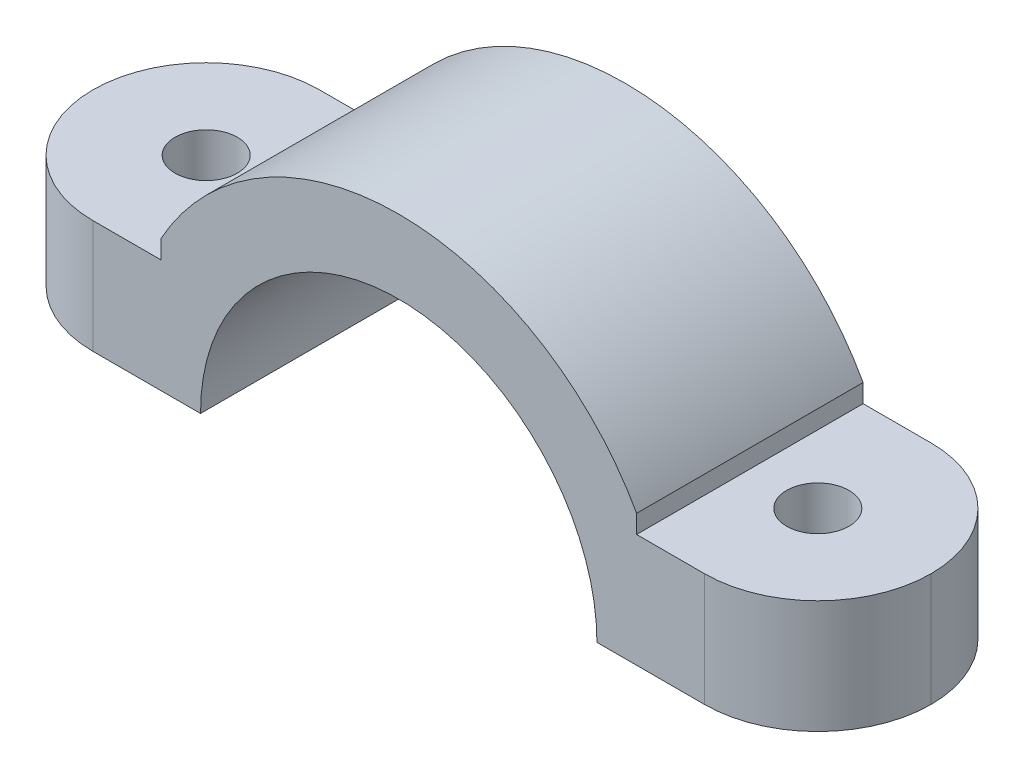
ISO-10303-21;
HEADER;
FILE_DESCRIPTION(('STEP AP214'),'2;1');
FILE_NAME('part.step','',(''),(''),'','','');
FILE_SCHEMA(('AUTOMOTIVE_DESIGN { 1 0 10303 214 1 1 1 1 }'));
ENDSEC;
DATA;
#1=APPLICATION_CONTEXT('core data for automotive mechanical design processes');
#2=APPLICATION_PROTOCOL_DEFINITION('international standard','automotive_design',2000,#1);
#3=PRODUCT_CONTEXT('',#1,'mechanical');
#4=PRODUCT('Part','Part','',(#3));
#5=PRODUCT_RELATED_PRODUCT_CATEGORY('part','',(#4));
#6=PRODUCT_DEFINITION_FORMATION('','',#4);
#7=PRODUCT_DEFINITION_CONTEXT('part definition',#1,'design');
#8=PRODUCT_DEFINITION('design','',#6,#7);
#9=PRODUCT_DEFINITION_SHAPE('','',#8);
#10=(LENGTH_UNIT() NAMED_UNIT(*) SI_UNIT(.MILLI.,.METRE.));
#11=(NAMED_UNIT(*) PLANE_ANGLE_UNIT() SI_UNIT($,.RADIAN.));
#12=(NAMED_UNIT(*) SI_UNIT($,.STERADIAN.) SOLID_ANGLE_UNIT());
#13=UNCERTAINTY_MEASURE_WITH_UNIT(LENGTH_MEASURE(1.E-05),#10,'distance_accuracy_value','');
#14=(GEOMETRIC_REPRESENTATION_CONTEXT(3) GLOBAL_UNCERTAINTY_ASSIGNED_CONTEXT((#13)) GLOBAL_UNIT_ASSIGNED_CONTEXT((#10,
#11,#12)) REPRESENTATION_CONTEXT('',''));
#15=CARTESIAN_POINT('',(0.,0.,0.));
#16=DIRECTION('',(0.,0.,1.));
#17=DIRECTION('',(1.,0.,0.));
#18=AXIS2_PLACEMENT_3D('',#15,#16,#17);
#19=CARTESIAN_POINT('',(-74.,20.,-20.));
#20=DIRECTION('',(0.,1.,0.));
#21=DIRECTION('',(0.,0.,1.));
#22=AXIS2_PLACEMENT_3D('',#19,#20,#21);
#23=PLANE('',#22);
#24=CARTESIAN_POINT('',(-54.,20.,0.));
#25=DIRECTION('',(0.,1.,0.));
#26=DIRECTION('',(0.,0.,1.));
#27=AXIS2_PLACEMENT_3D('',#24,#25,#26);
#28=CIRCLE('',#27,5.5);
#29=CARTESIAN_POINT('',(-54.,20.,5.5));
#30=VERTEX_POINT('',#29);
#31=EDGE_CURVE('E217',#30,#30,#28,.T.);
#32=ORIENTED_EDGE('',*,*,#31,.F.);
#33=EDGE_LOOP('',(#32));
#34=FACE_BOUND('',#33,.T.);
#35=DIRECTION('',(-1.,0.,0.));
#36=VECTOR('',#35,1.);
#37=CARTESIAN_POINT('',(-74.,20.,-20.));
#38=LINE('',#37,#36);
#39=CARTESIAN_POINT('',(-42.,20.,-20.));
#40=VERTEX_POINT('',#39);
#41=CARTESIAN_POINT('',(-54.,20.,-20.));
#42=VERTEX_POINT('',#41);
#43=EDGE_CURVE('E146',#40,#42,#38,.T.);
#44=ORIENTED_EDGE('',*,*,#43,.T.);
#45=CARTESIAN_POINT('',(-54.,20.,0.));
#46=DIRECTION('',(0.,1.,0.));
#47=DIRECTION('',(0.,0.,1.));
#48=AXIS2_PLACEMENT_3D('',#45,#46,#47);
#49=CIRCLE('',#48,20.);
#50=CARTESIAN_POINT('',(-74.,20.,0.));
#51=VERTEX_POINT('',#50);
#52=EDGE_CURVE('E207',#42,#51,#49,.T.);
#53=ORIENTED_EDGE('',*,*,#52,.T.);
#54=CARTESIAN_POINT('',(-54.,20.,0.));
#55=DIRECTION('',(0.,1.,0.));
#56=DIRECTION('',(0.,0.,1.));
#57=AXIS2_PLACEMENT_3D('',#54,#55,#56);
#58=CIRCLE('',#57,20.);
#59=CARTESIAN_POINT('',(-54.,20.,20.));
#60=VERTEX_POINT('',#59);
#61=EDGE_CURVE('E205',#51,#60,#58,.T.);
#62=ORIENTED_EDGE('',*,*,#61,.T.);
#63=DIRECTION('',(-1.,0.,0.));
#64=VECTOR('',#63,1.);
#65=CARTESIAN_POINT('',(-74.,20.,20.));
#66=LINE('',#65,#64);
#67=CARTESIAN_POINT('',(-42.,20.,20.));
#68=VERTEX_POINT('',#67);
#69=EDGE_CURVE('E165',#68,#60,#66,.T.);
#70=ORIENTED_EDGE('',*,*,#69,.F.);
#71=DIRECTION('',(0.,0.,1.));
#72=VECTOR('',#71,1.);
#73=CARTESIAN_POINT('',(-42.,20.,-20.));
#74=LINE('',#73,#72);
#75=EDGE_CURVE('E185',#40,#68,#74,.T.);
#76=ORIENTED_EDGE('',*,*,#75,.F.);
#77=EDGE_LOOP('',(#44,#53,#62,#70,#76));
#78=FACE_BOUND('',#77,.T.);
#79=ADVANCED_FACE('F33',(#34,#78),#23,.T.);
#80=CARTESIAN_POINT('',(-42.,23.2379000772445,-20.));
#81=DIRECTION('',(-1.,0.,0.));
#82=DIRECTION('',(0.,0.,1.));
#83=AXIS2_PLACEMENT_3D('',#80,#81,#82);
#84=PLANE('',#83);
#85=ORIENTED_EDGE('',*,*,#75,.T.);
#86=DIRECTION('',(0.,-1.,0.));
#87=VECTOR('',#86,1.);
#88=CARTESIAN_POINT('',(-42.,23.2379000772445,20.));
#89=LINE('',#88,#87);
#90=CARTESIAN_POINT('',(-42.,23.2379000772445,20.));
#91=VERTEX_POINT('',#90);
#92=EDGE_CURVE('E162',#91,#68,#89,.T.);
#93=ORIENTED_EDGE('',*,*,#92,.F.);
#94=DIRECTION('',(0.,0.,1.));
#95=VECTOR('',#94,1.);
#96=CARTESIAN_POINT('',(-42.,23.2379000772445,-20.));
#97=LINE('',#96,#95);
#98=CARTESIAN_POINT('',(-42.,23.2379000772445,-20.));
#99=VERTEX_POINT('',#98);
#100=EDGE_CURVE('E188',#99,#91,#97,.T.);
#101=ORIENTED_EDGE('',*,*,#100,.F.);
#102=DIRECTION('',(0.,-1.,0.));
#103=VECTOR('',#102,1.);
#104=CARTESIAN_POINT('',(-42.,23.2379000772445,-20.));
#105=LINE('',#104,#103);
#106=EDGE_CURVE('E180',#99,#40,#105,.T.);
#107=ORIENTED_EDGE('',*,*,#106,.T.);
#108=EDGE_LOOP('',(#85,#93,#101,#107));
#109=FACE_BOUND('',#108,.T.);
#110=ADVANCED_FACE('F245',(#109),#84,.T.);
#111=CARTESIAN_POINT('',(0.,0.,-20.));
#112=DIRECTION('',(0.,0.,1.));
#113=DIRECTION('',(1.,0.,0.));
#114=AXIS2_PLACEMENT_3D('',#111,#112,#113);
#115=CYLINDRICAL_SURFACE('',#114,48.);
#116=ORIENTED_EDGE('',*,*,#100,.T.);
#117=CARTESIAN_POINT('',(0.,0.,20.));
#118=DIRECTION('',(0.,0.,1.));
#119=DIRECTION('',(1.,0.,0.));
#120=AXIS2_PLACEMENT_3D('',#117,#118,#119);
#121=CIRCLE('',#120,48.);
#122=CARTESIAN_POINT('',(42.,23.2379000772445,20.));
#123=VERTEX_POINT('',#122);
#124=EDGE_CURVE('E159',#123,#91,#121,.T.);
#125=ORIENTED_EDGE('',*,*,#124,.F.);
#126=DIRECTION('',(0.,0.,1.));
#127=VECTOR('',#126,1.);
#128=CARTESIAN_POINT('',(42.,23.2379000772445,-20.));
#129=LINE('',#128,#127);
#130=CARTESIAN_POINT('',(42.,23.2379000772445,-20.));
#131=VERTEX_POINT('',#130);
#132=EDGE_CURVE('E190',#131,#123,#129,.T.);
#133=ORIENTED_EDGE('',*,*,#132,.F.);
#134=CARTESIAN_POINT('',(0.,0.,-20.));
#135=DIRECTION('',(0.,0.,1.));
#136=DIRECTION('',(1.,0.,0.));
#137=AXIS2_PLACEMENT_3D('',#134,#135,#136);
#138=CIRCLE('',#137,48.);
#139=EDGE_CURVE('E177',#131,#99,#138,.T.);
#140=ORIENTED_EDGE('',*,*,#139,.T.);
#141=EDGE_LOOP('',(#116,#125,#133,#140));
#142=FACE_BOUND('',#141,.T.);
#143=ADVANCED_FACE('F241',(#142),#115,.T.);
#144=CARTESIAN_POINT('',(42.,23.2379000772445,-20.));
#145=DIRECTION('',(1.,0.,0.));
#146=DIRECTION('',(0.,0.,-1.));
#147=AXIS2_PLACEMENT_3D('',#144,#145,#146);
#148=PLANE('',#147);
#149=ORIENTED_EDGE('',*,*,#132,.T.);
#150=DIRECTION('',(0.,1.,0.));
#151=VECTOR('',#150,1.);
#152=CARTESIAN_POINT('',(42.,23.2379000772445,20.));
#153=LINE('',#152,#151);
#154=CARTESIAN_POINT('',(42.,20.,20.));
#155=VERTEX_POINT('',#154);
#156=EDGE_CURVE('E156',#155,#123,#153,.T.);
#157=ORIENTED_EDGE('',*,*,#156,.F.);
#158=DIRECTION('',(0.,0.,1.));
#159=VECTOR('',#158,1.);
#160=CARTESIAN_POINT('',(42.,20.,-20.));
#161=LINE('',#160,#159);
#162=CARTESIAN_POINT('',(42.,20.,-20.));
#163=VERTEX_POINT('',#162);
#164=EDGE_CURVE('E192',#163,#155,#161,.T.);
#165=ORIENTED_EDGE('',*,*,#164,.F.);
#166=DIRECTION('',(0.,1.,0.));
#167=VECTOR('',#166,1.);
#168=CARTESIAN_POINT('',(42.,23.2379000772445,-20.));
#169=LINE('',#168,#167);
#170=EDGE_CURVE('E174',#163,#131,#169,.T.);
#171=ORIENTED_EDGE('',*,*,#170,.T.);
#172=EDGE_LOOP('',(#149,#157,#165,#171));
#173=FACE_BOUND('',#172,.T.);
#174=ADVANCED_FACE('F237',(#173),#148,.T.);
#175=CARTESIAN_POINT('',(42.,20.,-20.));
#176=DIRECTION('',(0.,1.,0.));
#177=DIRECTION('',(0.,0.,1.));
#178=AXIS2_PLACEMENT_3D('',#175,#176,#177);
#179=PLANE('',#178);
#180=CARTESIAN_POINT('',(54.,20.,0.));
#181=DIRECTION('',(0.,1.,0.));
#182=DIRECTION('',(0.,0.,1.));
#183=AXIS2_PLACEMENT_3D('',#180,#181,#182);
#184=CIRCLE('',#183,5.5);
#185=CARTESIAN_POINT('',(54.,20.,5.5));
#186=VERTEX_POINT('',#185);
#187=EDGE_CURVE('E296',#186,#186,#184,.T.);
#188=ORIENTED_EDGE('',*,*,#187,.F.);
#189=EDGE_LOOP('',(#188));
#190=FACE_BOUND('',#189,.T.);
#191=CARTESIAN_POINT('',(54.,20.,0.));
#192=DIRECTION('',(0.,1.,0.));
#193=DIRECTION('',(0.,0.,1.));
#194=AXIS2_PLACEMENT_3D('',#191,#192,#193);
#195=CIRCLE('',#194,20.);
#196=CARTESIAN_POINT('',(54.,20.,20.));
#197=VERTEX_POINT('',#196);
#198=CARTESIAN_POINT('',(74.,20.,0.));
#199=VERTEX_POINT('',#198);
#200=EDGE_CURVE('E56',#197,#199,#195,.T.);
#201=ORIENTED_EDGE('',*,*,#200,.T.);
#202=CARTESIAN_POINT('',(54.,20.,0.));
#203=DIRECTION('',(0.,1.,0.));
#204=DIRECTION('',(0.,0.,1.));
#205=AXIS2_PLACEMENT_3D('',#202,#203,#204);
#206=CIRCLE('',#205,20.);
#207=CARTESIAN_POINT('',(54.,20.,-20.));
#208=VERTEX_POINT('',#207);
#209=EDGE_CURVE('E213',#199,#208,#206,.T.);
#210=ORIENTED_EDGE('',*,*,#209,.T.);
#211=DIRECTION('',(-1.,0.,0.));
#212=VECTOR('',#211,1.);
#213=CARTESIAN_POINT('',(42.,20.,-20.));
#214=LINE('',#213,#212);
#215=EDGE_CURVE('E172',#208,#163,#214,.T.);
#216=ORIENTED_EDGE('',*,*,#215,.T.);
#217=ORIENTED_EDGE('',*,*,#164,.T.);
#218=DIRECTION('',(-1.,0.,0.));
#219=VECTOR('',#218,1.);
#220=CARTESIAN_POINT('',(42.,20.,20.));
#221=LINE('',#220,#219);
#222=EDGE_CURVE('E151',#197,#155,#221,.T.);
#223=ORIENTED_EDGE('',*,*,#222,.F.);
#224=EDGE_LOOP('',(#201,#210,#216,#217,#223));
#225=FACE_BOUND('',#224,.T.);
#226=ADVANCED_FACE('F231',(#190,#225),#179,.T.);
#227=CARTESIAN_POINT('',(35.,0.,-20.));
#228=DIRECTION('',(0.,-1.,0.));
#229=DIRECTION('',(0.,0.,-1.));
#230=AXIS2_PLACEMENT_3D('',#227,#228,#229);
#231=PLANE('',#230);
#232=CARTESIAN_POINT('',(54.,0.,0.));
#233=DIRECTION('',(0.,1.,0.));
#234=DIRECTION('',(0.,0.,1.));
#235=AXIS2_PLACEMENT_3D('',#232,#233,#234);
#236=CIRCLE('',#235,5.5);
#237=CARTESIAN_POINT('',(54.,0.,5.5));
#238=VERTEX_POINT('',#237);
#239=EDGE_CURVE('E135',#238,#238,#236,.T.);
#240=ORIENTED_EDGE('',*,*,#239,.T.);
#241=EDGE_LOOP('',(#240));
#242=FACE_BOUND('',#241,.T.);
#243=DIRECTION('',(1.,0.,0.));
#244=VECTOR('',#243,1.);
#245=CARTESIAN_POINT('',(35.,0.,-20.));
#246=LINE('',#245,#244);
#247=CARTESIAN_POINT('',(35.,0.,-20.));
#248=VERTEX_POINT('',#247);
#249=CARTESIAN_POINT('',(54.,0.,-20.));
#250=VERTEX_POINT('',#249);
#251=EDGE_CURVE('E170',#248,#250,#246,.T.);
#252=ORIENTED_EDGE('',*,*,#251,.T.);
#253=CARTESIAN_POINT('',(54.,0.,0.));
#254=DIRECTION('',(0.,-1.,0.));
#255=DIRECTION('',(0.,0.,-1.));
#256=AXIS2_PLACEMENT_3D('',#253,#254,#255);
#257=CIRCLE('',#256,20.);
#258=CARTESIAN_POINT('',(74.,0.,0.));
#259=VERTEX_POINT('',#258);
#260=EDGE_CURVE('E11',#250,#259,#257,.T.);
#261=ORIENTED_EDGE('',*,*,#260,.T.);
#262=CARTESIAN_POINT('',(54.,0.,0.));
#263=DIRECTION('',(0.,-1.,0.));
#264=DIRECTION('',(0.,0.,-1.));
#265=AXIS2_PLACEMENT_3D('',#262,#263,#264);
#266=CIRCLE('',#265,20.);
#267=CARTESIAN_POINT('',(54.,0.,20.));
#268=VERTEX_POINT('',#267);
#269=EDGE_CURVE('E42',#259,#268,#266,.T.);
#270=ORIENTED_EDGE('',*,*,#269,.T.);
#271=DIRECTION('',(1.,0.,0.));
#272=VECTOR('',#271,1.);
#273=CARTESIAN_POINT('',(35.,0.,20.));
#274=LINE('',#273,#272);
#275=CARTESIAN_POINT('',(35.,0.,20.));
#276=VERTEX_POINT('',#275);
#277=EDGE_CURVE('E149',#276,#268,#274,.T.);
#278=ORIENTED_EDGE('',*,*,#277,.F.);
#279=DIRECTION('',(0.,0.,1.));
#280=VECTOR('',#279,1.);
#281=CARTESIAN_POINT('',(35.,0.,-20.));
#282=LINE('',#281,#280);
#283=EDGE_CURVE('E145',#248,#276,#282,.T.);
#284=ORIENTED_EDGE('',*,*,#283,.F.);
#285=EDGE_LOOP('',(#252,#261,#270,#278,#284));
#286=FACE_BOUND('',#285,.T.);
#287=ADVANCED_FACE('F230',(#242,#286),#231,.T.);
#288=CARTESIAN_POINT('',(0.,0.,-20.));
#289=DIRECTION('',(0.,0.,1.));
#290=DIRECTION('',(1.,0.,0.));
#291=AXIS2_PLACEMENT_3D('',#288,#289,#290);
#292=CYLINDRICAL_SURFACE('',#291,35.);
#293=ORIENTED_EDGE('',*,*,#283,.T.);
#294=CARTESIAN_POINT('',(0.,0.,20.));
#295=DIRECTION('',(0.,0.,-1.));
#296=DIRECTION('',(1.,0.,0.));
#297=AXIS2_PLACEMENT_3D('',#294,#295,#296);
#298=CIRCLE('',#297,35.);
#299=CARTESIAN_POINT('',(-35.,0.,20.));
#300=VERTEX_POINT('',#299);
#301=EDGE_CURVE('E129',#300,#276,#298,.T.);
#302=ORIENTED_EDGE('',*,*,#301,.F.);
#303=DIRECTION('',(0.,0.,1.));
#304=VECTOR('',#303,1.);
#305=CARTESIAN_POINT('',(-35.,0.,-20.));
#306=LINE('',#305,#304);
#307=CARTESIAN_POINT('',(-35.,0.,-20.));
#308=VERTEX_POINT('',#307);
#309=EDGE_CURVE('E138',#308,#300,#306,.T.);
#310=ORIENTED_EDGE('',*,*,#309,.F.);
#311=CARTESIAN_POINT('',(0.,0.,-20.));
#312=DIRECTION('',(0.,0.,-1.));
#313=DIRECTION('',(1.,0.,0.));
#314=AXIS2_PLACEMENT_3D('',#311,#312,#313);
#315=CIRCLE('',#314,35.);
#316=EDGE_CURVE('E168',#308,#248,#315,.T.);
#317=ORIENTED_EDGE('',*,*,#316,.T.);
#318=EDGE_LOOP('',(#293,#302,#310,#317));
#319=FACE_BOUND('',#318,.T.);
#320=ADVANCED_FACE('F148',(#319),#292,.F.);
#321=CARTESIAN_POINT('',(-74.,0.,-20.));
#322=DIRECTION('',(0.,-1.,0.));
#323=DIRECTION('',(0.,0.,-1.));
#324=AXIS2_PLACEMENT_3D('',#321,#322,#323);
#325=PLANE('',#324);
#326=CARTESIAN_POINT('',(-54.,0.,0.));
#327=DIRECTION('',(0.,1.,0.));
#328=DIRECTION('',(0.,0.,1.));
#329=AXIS2_PLACEMENT_3D('',#326,#327,#328);
#330=CIRCLE('',#329,5.5);
#331=CARTESIAN_POINT('',(-54.,0.,5.5));
#332=VERTEX_POINT('',#331);
#333=EDGE_CURVE('E222',#332,#332,#330,.T.);
#334=ORIENTED_EDGE('',*,*,#333,.T.);
#335=EDGE_LOOP('',(#334));
#336=FACE_BOUND('',#335,.T.);
#337=CARTESIAN_POINT('',(-54.,0.,0.));
#338=DIRECTION('',(0.,-1.,0.));
#339=DIRECTION('',(0.,0.,-1.));
#340=AXIS2_PLACEMENT_3D('',#337,#338,#339);
#341=CIRCLE('',#340,20.);
#342=CARTESIAN_POINT('',(-54.,0.,20.));
#343=VERTEX_POINT('',#342);
#344=CARTESIAN_POINT('',(-74.,0.,0.));
#345=VERTEX_POINT('',#344);
#346=EDGE_CURVE('E187',#343,#345,#341,.T.);
#347=ORIENTED_EDGE('',*,*,#346,.T.);
#348=CARTESIAN_POINT('',(-54.,0.,0.));
#349=DIRECTION('',(0.,-1.,0.));
#350=DIRECTION('',(0.,0.,-1.));
#351=AXIS2_PLACEMENT_3D('',#348,#349,#350);
#352=CIRCLE('',#351,20.);
#353=CARTESIAN_POINT('',(-54.,0.,-20.));
#354=VERTEX_POINT('',#353);
#355=EDGE_CURVE('E197',#345,#354,#352,.T.);
#356=ORIENTED_EDGE('',*,*,#355,.T.);
#357=DIRECTION('',(1.,0.,0.));
#358=VECTOR('',#357,1.);
#359=CARTESIAN_POINT('',(-74.,0.,-20.));
#360=LINE('',#359,#358);
#361=EDGE_CURVE('E141',#354,#308,#360,.T.);
#362=ORIENTED_EDGE('',*,*,#361,.T.);
#363=ORIENTED_EDGE('',*,*,#309,.T.);
#364=DIRECTION('',(1.,0.,0.));
#365=VECTOR('',#364,1.);
#366=CARTESIAN_POINT('',(-74.,0.,20.));
#367=LINE('',#366,#365);
#368=EDGE_CURVE('E123',#343,#300,#367,.T.);
#369=ORIENTED_EDGE('',*,*,#368,.F.);
#370=EDGE_LOOP('',(#347,#356,#362,#363,#369));
#371=FACE_BOUND('',#370,.T.);
#372=ADVANCED_FACE('F139',(#336,#371),#325,.T.);
#373=CARTESIAN_POINT('',(0.,0.,-20.));
#374=DIRECTION('',(0.,0.,1.));
#375=DIRECTION('',(1.,0.,0.));
#376=AXIS2_PLACEMENT_3D('',#373,#374,#375);
#377=PLANE('',#376);
#378=ORIENTED_EDGE('',*,*,#361,.F.);
#379=DIRECTION('',(0.,-1.,0.));
#380=VECTOR('',#379,1.);
#381=CARTESIAN_POINT('',(-54.,20.,-20.));
#382=LINE('',#381,#380);
#383=EDGE_CURVE('E202',#354,#42,#382,.F.);
#384=ORIENTED_EDGE('',*,*,#383,.T.);
#385=ORIENTED_EDGE('',*,*,#43,.F.);
#386=ORIENTED_EDGE('',*,*,#106,.F.);
#387=ORIENTED_EDGE('',*,*,#139,.F.);
#388=ORIENTED_EDGE('',*,*,#170,.F.);
#389=ORIENTED_EDGE('',*,*,#215,.F.);
#390=DIRECTION('',(0.,1.,0.));
#391=VECTOR('',#390,1.);
#392=CARTESIAN_POINT('',(54.,0.,-20.));
#393=LINE('',#392,#391);
#394=EDGE_CURVE('E199',#208,#250,#393,.F.);
#395=ORIENTED_EDGE('',*,*,#394,.T.);
#396=ORIENTED_EDGE('',*,*,#251,.F.);
#397=ORIENTED_EDGE('',*,*,#316,.F.);
#398=EDGE_LOOP('',(#378,#384,#385,#386,#387,#388,#389,#395,#396,#397));
#399=FACE_BOUND('',#398,.T.);
#400=ADVANCED_FACE('F248',(#399),#377,.F.);
#401=CARTESIAN_POINT('',(0.,0.,20.));
#402=DIRECTION('',(0.,0.,1.));
#403=DIRECTION('',(1.,0.,0.));
#404=AXIS2_PLACEMENT_3D('',#401,#402,#403);
#405=PLANE('',#404);
#406=ORIENTED_EDGE('',*,*,#69,.T.);
#407=DIRECTION('',(0.,-1.,0.));
#408=VECTOR('',#407,1.);
#409=CARTESIAN_POINT('',(-54.,0.,20.));
#410=LINE('',#409,#408);
#411=EDGE_CURVE('E132',#60,#343,#410,.T.);
#412=ORIENTED_EDGE('',*,*,#411,.T.);
#413=ORIENTED_EDGE('',*,*,#368,.T.);
#414=ORIENTED_EDGE('',*,*,#301,.T.);
#415=ORIENTED_EDGE('',*,*,#277,.T.);
#416=DIRECTION('',(0.,1.,0.));
#417=VECTOR('',#416,1.);
#418=CARTESIAN_POINT('',(54.,0.,20.));
#419=LINE('',#418,#417);
#420=EDGE_CURVE('E209',#268,#197,#419,.T.);
#421=ORIENTED_EDGE('',*,*,#420,.T.);
#422=ORIENTED_EDGE('',*,*,#222,.T.);
#423=ORIENTED_EDGE('',*,*,#156,.T.);
#424=ORIENTED_EDGE('',*,*,#124,.T.);
#425=ORIENTED_EDGE('',*,*,#92,.T.);
#426=EDGE_LOOP('',(#406,#412,#413,#414,#415,#421,#422,#423,#424,#425));
#427=FACE_BOUND('',#426,.T.);
#428=ADVANCED_FACE('F126',(#427),#405,.T.);
#429=CARTESIAN_POINT('',(-54.,0.,0.));
#430=DIRECTION('',(0.,1.,0.));
#431=DIRECTION('',(0.,0.,1.));
#432=AXIS2_PLACEMENT_3D('',#429,#430,#431);
#433=CYLINDRICAL_SURFACE('',#432,5.5);
#434=ORIENTED_EDGE('',*,*,#333,.F.);
#435=EDGE_LOOP('',(#434));
#436=FACE_BOUND('',#435,.T.);
#437=ORIENTED_EDGE('',*,*,#31,.T.);
#438=EDGE_LOOP('',(#437));
#439=FACE_BOUND('',#438,.T.);
#440=ADVANCED_FACE('F306',(#436,#439),#433,.F.);
#441=CARTESIAN_POINT('',(54.,0.,0.));
#442=DIRECTION('',(0.,1.,0.));
#443=DIRECTION('',(0.,0.,1.));
#444=AXIS2_PLACEMENT_3D('',#441,#442,#443);
#445=CYLINDRICAL_SURFACE('',#444,5.5);
#446=ORIENTED_EDGE('',*,*,#239,.F.);
#447=EDGE_LOOP('',(#446));
#448=FACE_BOUND('',#447,.T.);
#449=ORIENTED_EDGE('',*,*,#187,.T.);
#450=EDGE_LOOP('',(#449));
#451=FACE_BOUND('',#450,.T.);
#452=ADVANCED_FACE('F263',(#448,#451),#445,.F.);
#453=CARTESIAN_POINT('',(-54.,0.,0.));
#454=DIRECTION('',(0.,-1.,0.));
#455=DIRECTION('',(0.,0.,-1.));
#456=AXIS2_PLACEMENT_3D('',#453,#454,#455);
#457=CYLINDRICAL_SURFACE('',#456,20.);
#458=ORIENTED_EDGE('',*,*,#411,.F.);
#459=ORIENTED_EDGE('',*,*,#61,.F.);
#460=DIRECTION('',(0.,-1.,0.));
#461=VECTOR('',#460,1.);
#462=CARTESIAN_POINT('',(-74.,20.,0.));
#463=LINE('',#462,#461);
#464=EDGE_CURVE('E215',#345,#51,#463,.F.);
#465=ORIENTED_EDGE('',*,*,#464,.F.);
#466=ORIENTED_EDGE('',*,*,#346,.F.);
#467=EDGE_LOOP('',(#458,#459,#465,#466));
#468=FACE_BOUND('',#467,.T.);
#469=ADVANCED_FACE('F254',(#468),#457,.T.);
#470=CARTESIAN_POINT('',(-54.,20.,0.));
#471=DIRECTION('',(0.,1.,0.));
#472=DIRECTION('',(0.,0.,1.));
#473=AXIS2_PLACEMENT_3D('',#470,#471,#472);
#474=CYLINDRICAL_SURFACE('',#473,20.);
#475=ORIENTED_EDGE('',*,*,#52,.F.);
#476=ORIENTED_EDGE('',*,*,#383,.F.);
#477=ORIENTED_EDGE('',*,*,#355,.F.);
#478=ORIENTED_EDGE('',*,*,#464,.T.);
#479=EDGE_LOOP('',(#475,#476,#477,#478));
#480=FACE_BOUND('',#479,.T.);
#481=ADVANCED_FACE('F256',(#480),#474,.T.);
#482=CARTESIAN_POINT('',(54.,0.,0.));
#483=DIRECTION('',(0.,1.,0.));
#484=DIRECTION('',(0.,0.,1.));
#485=AXIS2_PLACEMENT_3D('',#482,#483,#484);
#486=CYLINDRICAL_SURFACE('',#485,20.);
#487=ORIENTED_EDGE('',*,*,#420,.F.);
#488=ORIENTED_EDGE('',*,*,#269,.F.);
#489=DIRECTION('',(0.,1.,0.));
#490=VECTOR('',#489,1.);
#491=CARTESIAN_POINT('',(74.,20.,0.));
#492=LINE('',#491,#490);
#493=EDGE_CURVE('E37',#199,#259,#492,.F.);
#494=ORIENTED_EDGE('',*,*,#493,.F.);
#495=ORIENTED_EDGE('',*,*,#200,.F.);
#496=EDGE_LOOP('',(#487,#488,#494,#495));
#497=FACE_BOUND('',#496,.T.);
#498=ADVANCED_FACE('F35',(#497),#486,.T.);
#499=CARTESIAN_POINT('',(54.,20.,0.));
#500=DIRECTION('',(0.,-1.,0.));
#501=DIRECTION('',(0.,0.,-1.));
#502=AXIS2_PLACEMENT_3D('',#499,#500,#501);
#503=CYLINDRICAL_SURFACE('',#502,20.);
#504=ORIENTED_EDGE('',*,*,#260,.F.);
#505=ORIENTED_EDGE('',*,*,#394,.F.);
#506=ORIENTED_EDGE('',*,*,#209,.F.);
#507=ORIENTED_EDGE('',*,*,#493,.T.);
#508=EDGE_LOOP('',(#504,#505,#506,#507));
#509=FACE_BOUND('',#508,.T.);
#510=ADVANCED_FACE('F226',(#509),#503,.T.);
#511=CLOSED_SHELL('',(#79,#110,#143,#174,#226,#287,#320,#372,#400,#428,#440,#452,#469,#481,#498,#510));
#512=MANIFOLD_SOLID_BREP('B2',#511);
#513=ADVANCED_BREP_SHAPE_REPRESENTATION('',(#18,#512),#14);
#514=SHAPE_DEFINITION_REPRESENTATION(#9,#513);
ENDSEC;
END-ISO-10303-21;
